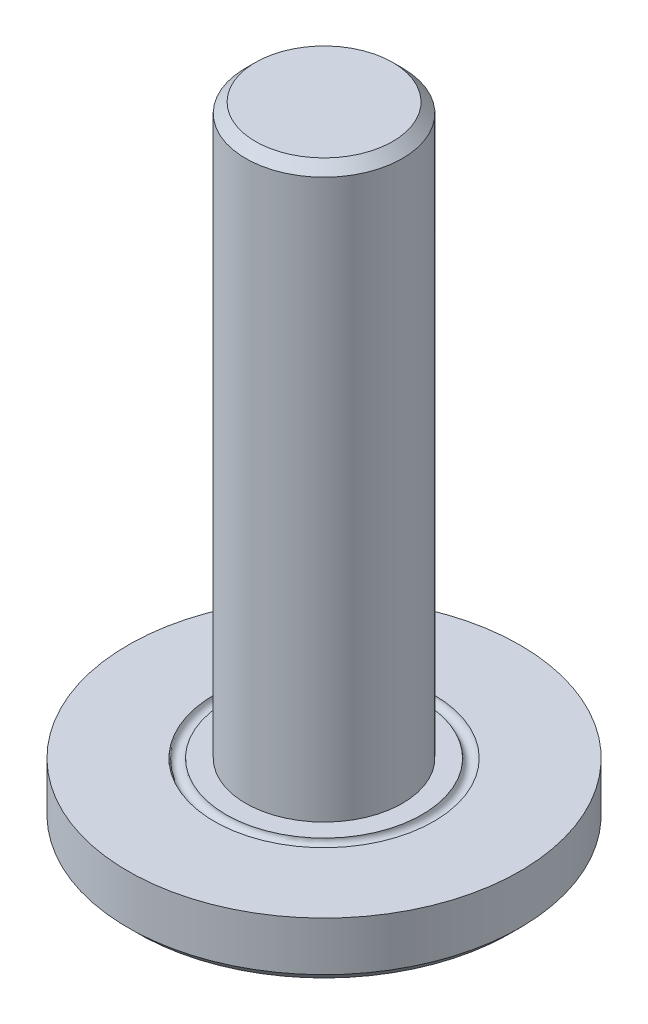
ISO-10303-21;
HEADER;
FILE_DESCRIPTION(('STEP AP214'),'2;1');
FILE_NAME('part.step','',(''),(''),'','','');
FILE_SCHEMA(('AUTOMOTIVE_DESIGN { 1 0 10303 214 1 1 1 1 }'));
ENDSEC;
DATA;
#1=APPLICATION_CONTEXT('core data for automotive mechanical design processes');
#2=APPLICATION_PROTOCOL_DEFINITION('international standard','automotive_design',2000,#1);
#3=PRODUCT_CONTEXT('',#1,'mechanical');
#4=PRODUCT('Part','Part','',(#3));
#5=PRODUCT_RELATED_PRODUCT_CATEGORY('part','',(#4));
#6=PRODUCT_DEFINITION_FORMATION('','',#4);
#7=PRODUCT_DEFINITION_CONTEXT('part definition',#1,'design');
#8=PRODUCT_DEFINITION('design','',#6,#7);
#9=PRODUCT_DEFINITION_SHAPE('','',#8);
#10=(LENGTH_UNIT() NAMED_UNIT(*) SI_UNIT(.MILLI.,.METRE.));
#11=(NAMED_UNIT(*) PLANE_ANGLE_UNIT() SI_UNIT($,.RADIAN.));
#12=(NAMED_UNIT(*) SI_UNIT($,.STERADIAN.) SOLID_ANGLE_UNIT());
#13=UNCERTAINTY_MEASURE_WITH_UNIT(LENGTH_MEASURE(1.E-05),#10,'distance_accuracy_value','');
#14=(GEOMETRIC_REPRESENTATION_CONTEXT(3) GLOBAL_UNCERTAINTY_ASSIGNED_CONTEXT((#13)) GLOBAL_UNIT_ASSIGNED_CONTEXT((#10,
#11,#12)) REPRESENTATION_CONTEXT('',''));
#15=CARTESIAN_POINT('',(0.,0.,0.));
#16=DIRECTION('',(0.,0.,1.));
#17=DIRECTION('',(1.,0.,0.));
#18=AXIS2_PLACEMENT_3D('',#15,#16,#17);
#19=CARTESIAN_POINT('',(2160.44957688834,589.234614361018,716.131939028989));
#20=DIRECTION('',(0.,1.,2.33732659270483E-13));
#21=DIRECTION('',(0.,-2.33732659270483E-13,1.));
#22=AXIS2_PLACEMENT_3D('',#19,#20,#21);
#23=CONICAL_SURFACE('',#22,9.99999999999979,0.785398163397226);
#24=CARTESIAN_POINT('',(2160.44957688834,588.734614361018,716.131939028989));
#25=DIRECTION('',(0.,-1.,-2.33732659270483E-13));
#26=DIRECTION('',(0.,2.33732659270483E-13,-1.));
#27=AXIS2_PLACEMENT_3D('',#24,#25,#26);
#28=CIRCLE('',#27,9.50000000000006);
#29=CARTESIAN_POINT('',(2160.44957688834,588.73461436102,706.631939028989));
#30=VERTEX_POINT('',#29);
#31=EDGE_CURVE('E59',#30,#30,#28,.T.);
#32=ORIENTED_EDGE('',*,*,#31,.F.);
#33=EDGE_LOOP('',(#32));
#34=FACE_BOUND('',#33,.T.);
#35=CARTESIAN_POINT('',(2160.44957688834,589.234614361018,716.131939028989));
#36=DIRECTION('',(0.,-1.,-2.33732659270483E-13));
#37=DIRECTION('',(0.,2.33732659270483E-13,-1.));
#38=AXIS2_PLACEMENT_3D('',#35,#36,#37);
#39=CIRCLE('',#38,9.99999999999979);
#40=CARTESIAN_POINT('',(2160.44957688834,589.23461436102,706.13193902899));
#41=VERTEX_POINT('',#40);
#42=EDGE_CURVE('E10',#41,#41,#39,.T.);
#43=ORIENTED_EDGE('',*,*,#42,.T.);
#44=EDGE_LOOP('',(#43));
#45=FACE_BOUND('',#44,.T.);
#46=ADVANCED_FACE('F31',(#34,#45),#23,.T.);
#47=CARTESIAN_POINT('',(2160.44957688834,588.734614361018,716.131939028989));
#48=DIRECTION('',(0.,-1.,-2.33732659270483E-13));
#49=DIRECTION('',(0.,2.33732659270483E-13,-1.));
#50=AXIS2_PLACEMENT_3D('',#47,#48,#49);
#51=CYLINDRICAL_SURFACE('',#50,9.99999999999979);
#52=ORIENTED_EDGE('',*,*,#42,.F.);
#53=EDGE_LOOP('',(#52));
#54=FACE_BOUND('',#53,.T.);
#55=CARTESIAN_POINT('',(2160.44957688834,591.734512957886,716.13193902899));
#56=DIRECTION('',(0.,-1.,-2.33732659270483E-13));
#57=DIRECTION('',(0.,2.33732659270483E-13,-1.));
#58=AXIS2_PLACEMENT_3D('',#55,#56,#57);
#59=CIRCLE('',#58,9.99999999999979);
#60=CARTESIAN_POINT('',(2160.44957688834,591.734512957888,706.13193902899));
#61=VERTEX_POINT('',#60);
#62=EDGE_CURVE('E37',#61,#61,#59,.T.);
#63=ORIENTED_EDGE('',*,*,#62,.T.);
#64=EDGE_LOOP('',(#63));
#65=FACE_BOUND('',#64,.T.);
#66=ADVANCED_FACE('F68',(#54,#65),#51,.T.);
#67=CARTESIAN_POINT('',(2166.04957684892,591.734512957886,716.13193902899));
#68=DIRECTION('',(0.,-1.,-2.33732659270483E-13));
#69=DIRECTION('',(0.,2.33732659270483E-13,-1.));
#70=AXIS2_PLACEMENT_3D('',#67,#68,#69);
#71=PLANE('',#70);
#72=ORIENTED_EDGE('',*,*,#62,.F.);
#73=EDGE_LOOP('',(#72));
#74=FACE_BOUND('',#73,.T.);
#75=CARTESIAN_POINT('',(2160.44957688834,591.734512957886,716.13193902899));
#76=DIRECTION('',(0.,-1.,-2.33732659270483E-13));
#77=DIRECTION('',(0.,2.33732659270483E-13,-1.));
#78=AXIS2_PLACEMENT_3D('',#75,#76,#77);
#79=CIRCLE('',#78,5.5999999605767);
#80=CARTESIAN_POINT('',(2160.44957688834,591.734512957887,710.531939068413));
#81=VERTEX_POINT('',#80);
#82=EDGE_CURVE('E41',#81,#81,#79,.T.);
#83=ORIENTED_EDGE('',*,*,#82,.T.);
#84=EDGE_LOOP('',(#83));
#85=FACE_BOUND('',#84,.T.);
#86=ADVANCED_FACE('F72',(#74,#85),#71,.F.);
#87=CARTESIAN_POINT('',(2160.44957688834,591.734359160488,716.13193902899));
#88=DIRECTION('',(0.,-1.,-2.33732659270483E-13));
#89=DIRECTION('',(0.,2.33732659270483E-13,-1.));
#90=AXIS2_PLACEMENT_3D('',#87,#88,#89);
#91=TOROIDAL_SURFACE('',#90,5.29999999999964,0.299999999999769);
#92=ORIENTED_EDGE('',*,*,#82,.F.);
#93=EDGE_LOOP('',(#92));
#94=FACE_BOUND('',#93,.T.);
#95=CARTESIAN_POINT('',(2160.44957688834,591.734359160488,716.13193902899));
#96=DIRECTION('',(0.,-1.,-2.33732659270483E-13));
#97=DIRECTION('',(0.,2.33732659270483E-13,-1.));
#98=AXIS2_PLACEMENT_3D('',#95,#96,#97);
#99=CIRCLE('',#98,4.99999999999989);
#100=CARTESIAN_POINT('',(2160.44957688834,591.734359160489,711.13193902899));
#101=VERTEX_POINT('',#100);
#102=EDGE_CURVE('E45',#101,#101,#99,.T.);
#103=ORIENTED_EDGE('',*,*,#102,.T.);
#104=EDGE_LOOP('',(#103));
#105=FACE_BOUND('',#104,.T.);
#106=ADVANCED_FACE('F77',(#94,#105),#91,.F.);
#107=CARTESIAN_POINT('',(2164.44957688834,591.734359160488,716.13193902899));
#108=DIRECTION('',(0.,-1.,-2.33732659270483E-13));
#109=DIRECTION('',(0.,2.33732659270483E-13,-1.));
#110=AXIS2_PLACEMENT_3D('',#107,#108,#109);
#111=PLANE('',#110);
#112=ORIENTED_EDGE('',*,*,#102,.F.);
#113=EDGE_LOOP('',(#112));
#114=FACE_BOUND('',#113,.T.);
#115=CARTESIAN_POINT('',(2160.44957688834,591.734359160488,716.13193902899));
#116=DIRECTION('',(0.,-1.,-2.33732659270483E-13));
#117=DIRECTION('',(0.,2.33732659270483E-13,-1.));
#118=AXIS2_PLACEMENT_3D('',#115,#116,#117);
#119=CIRCLE('',#118,4.);
#120=CARTESIAN_POINT('',(2160.44957688834,591.734359160489,712.13193902899));
#121=VERTEX_POINT('',#120);
#122=EDGE_CURVE('E50',#121,#121,#119,.T.);
#123=ORIENTED_EDGE('',*,*,#122,.T.);
#124=EDGE_LOOP('',(#123));
#125=FACE_BOUND('',#124,.T.);
#126=ADVANCED_FACE('F83',(#114,#125),#111,.F.);
#127=CARTESIAN_POINT('',(2160.44957688834,588.734614361018,716.131939028989));
#128=DIRECTION('',(0.,-1.,-2.33732659270483E-13));
#129=DIRECTION('',(0.,2.33732659270483E-13,-1.));
#130=AXIS2_PLACEMENT_3D('',#127,#128,#129);
#131=CYLINDRICAL_SURFACE('',#130,4.);
#132=ORIENTED_EDGE('',*,*,#122,.F.);
#133=EDGE_LOOP('',(#132));
#134=FACE_BOUND('',#133,.T.);
#135=CARTESIAN_POINT('',(2160.44957688834,620.234614361018,716.131939028997));
#136=DIRECTION('',(0.,-1.,-2.33732659270483E-13));
#137=DIRECTION('',(0.,2.33732659270483E-13,-1.));
#138=AXIS2_PLACEMENT_3D('',#135,#136,#137);
#139=CIRCLE('',#138,4.);
#140=CARTESIAN_POINT('',(2160.44957688834,620.234614361019,712.131939028997));
#141=VERTEX_POINT('',#140);
#142=EDGE_CURVE('E53',#141,#141,#139,.T.);
#143=ORIENTED_EDGE('',*,*,#142,.T.);
#144=EDGE_LOOP('',(#143));
#145=FACE_BOUND('',#144,.T.);
#146=ADVANCED_FACE('F87',(#134,#145),#131,.T.);
#147=CARTESIAN_POINT('',(2160.44957688834,620.734614361018,716.131939028997));
#148=DIRECTION('',(0.,-1.,-2.33732659270483E-13));
#149=DIRECTION('',(0.,2.33732659270483E-13,-1.));
#150=AXIS2_PLACEMENT_3D('',#147,#148,#149);
#151=CONICAL_SURFACE('',#150,3.49999999999984,0.78539816339767);
#152=ORIENTED_EDGE('',*,*,#142,.F.);
#153=EDGE_LOOP('',(#152));
#154=FACE_BOUND('',#153,.T.);
#155=CARTESIAN_POINT('',(2160.44957688834,620.734614361018,716.131939028997));
#156=DIRECTION('',(0.,-1.,-2.33732659270483E-13));
#157=DIRECTION('',(0.,2.33732659270483E-13,-1.));
#158=AXIS2_PLACEMENT_3D('',#155,#156,#157);
#159=CIRCLE('',#158,3.49999999999984);
#160=CARTESIAN_POINT('',(2160.44957688834,620.734614361019,712.631939028997));
#161=VERTEX_POINT('',#160);
#162=EDGE_CURVE('E56',#161,#161,#159,.T.);
#163=ORIENTED_EDGE('',*,*,#162,.T.);
#164=EDGE_LOOP('',(#163));
#165=FACE_BOUND('',#164,.T.);
#166=ADVANCED_FACE('F91',(#154,#165),#151,.T.);
#167=CARTESIAN_POINT('',(2160.44957688834,620.734614361018,716.131939028997));
#168=DIRECTION('',(0.,-1.,-2.33732659270483E-13));
#169=DIRECTION('',(0.,2.33732659270483E-13,-1.));
#170=AXIS2_PLACEMENT_3D('',#167,#168,#169);
#171=PLANE('',#170);
#172=ORIENTED_EDGE('',*,*,#162,.F.);
#173=EDGE_LOOP('',(#172));
#174=FACE_BOUND('',#173,.T.);
#175=ADVANCED_FACE('F95',(#174),#171,.F.);
#176=CARTESIAN_POINT('',(2169.94957688834,588.734614361018,716.131939028989));
#177=DIRECTION('',(0.,1.,2.33732659270483E-13));
#178=DIRECTION('',(0.,-2.33732659270483E-13,1.));
#179=AXIS2_PLACEMENT_3D('',#176,#177,#178);
#180=PLANE('',#179);
#181=ORIENTED_EDGE('',*,*,#31,.T.);
#182=EDGE_LOOP('',(#181));
#183=FACE_BOUND('',#182,.T.);
#184=ADVANCED_FACE('F65',(#183),#180,.F.);
#185=CLOSED_SHELL('',(#46,#66,#86,#106,#126,#146,#166,#175,#184));
#186=MANIFOLD_SOLID_BREP('B2',#185);
#187=ADVANCED_BREP_SHAPE_REPRESENTATION('',(#18,#186),#14);
#188=SHAPE_DEFINITION_REPRESENTATION(#9,#187);
ENDSEC;
END-ISO-10303-21;
